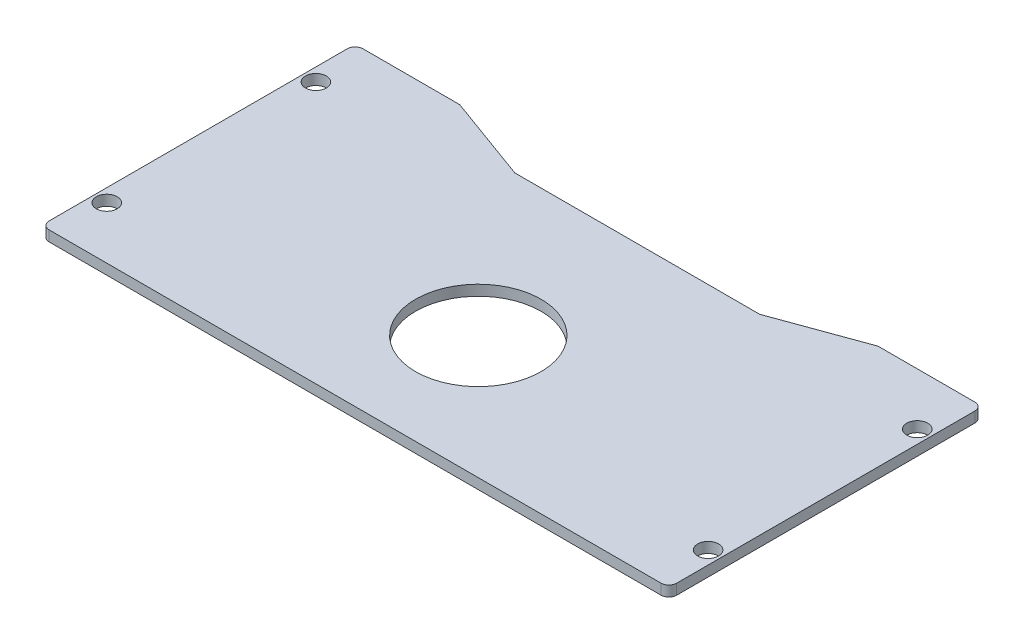
ISO-10303-21;
HEADER;
FILE_DESCRIPTION(('STEP AP214'),'2;1');
FILE_NAME('part.step','',(''),(''),'','','');
FILE_SCHEMA(('AUTOMOTIVE_DESIGN { 1 0 10303 214 1 1 1 1 }'));
ENDSEC;
DATA;
#1=APPLICATION_CONTEXT('core data for automotive mechanical design processes');
#2=APPLICATION_PROTOCOL_DEFINITION('international standard','automotive_design',2000,#1);
#3=PRODUCT_CONTEXT('',#1,'mechanical');
#4=PRODUCT('Part','Part','',(#3));
#5=PRODUCT_RELATED_PRODUCT_CATEGORY('part','',(#4));
#6=PRODUCT_DEFINITION_FORMATION('','',#4);
#7=PRODUCT_DEFINITION_CONTEXT('part definition',#1,'design');
#8=PRODUCT_DEFINITION('design','',#6,#7);
#9=PRODUCT_DEFINITION_SHAPE('','',#8);
#10=(LENGTH_UNIT() NAMED_UNIT(*) SI_UNIT(.MILLI.,.METRE.));
#11=(NAMED_UNIT(*) PLANE_ANGLE_UNIT() SI_UNIT($,.RADIAN.));
#12=(NAMED_UNIT(*) SI_UNIT($,.STERADIAN.) SOLID_ANGLE_UNIT());
#13=UNCERTAINTY_MEASURE_WITH_UNIT(LENGTH_MEASURE(1.E-05),#10,'distance_accuracy_value','');
#14=(GEOMETRIC_REPRESENTATION_CONTEXT(3) GLOBAL_UNCERTAINTY_ASSIGNED_CONTEXT((#13)) GLOBAL_UNIT_ASSIGNED_CONTEXT((#10,
#11,#12)) REPRESENTATION_CONTEXT('',''));
#15=CARTESIAN_POINT('',(0.,0.,0.));
#16=DIRECTION('',(0.,0.,1.));
#17=DIRECTION('',(1.,0.,0.));
#18=AXIS2_PLACEMENT_3D('',#15,#16,#17);
#19=CARTESIAN_POINT('',(0.,2.,-60.));
#20=DIRECTION('',(0.,0.,1.));
#21=DIRECTION('',(1.,0.,0.));
#22=AXIS2_PLACEMENT_3D('',#19,#20,#21);
#23=PLANE('',#22);
#24=DIRECTION('',(-1.,0.,0.));
#25=VECTOR('',#24,1.);
#26=CARTESIAN_POINT('',(0.,0.,-60.));
#27=LINE('',#26,#25);
#28=CARTESIAN_POINT('',(20.,0.,-60.));
#29=VERTEX_POINT('',#28);
#30=CARTESIAN_POINT('',(1.5,0.,-60.));
#31=VERTEX_POINT('',#30);
#32=EDGE_CURVE('E152',#29,#31,#27,.T.);
#33=ORIENTED_EDGE('',*,*,#32,.T.);
#34=DIRECTION('',(0.,-1.,0.));
#35=VECTOR('',#34,1.);
#36=CARTESIAN_POINT('',(1.5,2.,-60.));
#37=LINE('',#36,#35);
#38=CARTESIAN_POINT('',(1.5,2.,-60.));
#39=VERTEX_POINT('',#38);
#40=EDGE_CURVE('E11',#31,#39,#37,.F.);
#41=ORIENTED_EDGE('',*,*,#40,.T.);
#42=DIRECTION('',(-1.,0.,0.));
#43=VECTOR('',#42,1.);
#44=CARTESIAN_POINT('',(0.,2.,-60.));
#45=LINE('',#44,#43);
#46=CARTESIAN_POINT('',(20.,2.,-60.));
#47=VERTEX_POINT('',#46);
#48=EDGE_CURVE('E155',#47,#39,#45,.T.);
#49=ORIENTED_EDGE('',*,*,#48,.F.);
#50=DIRECTION('',(0.,1.,0.));
#51=VECTOR('',#50,1.);
#52=CARTESIAN_POINT('',(20.,-80.2273483978274,-60.));
#53=LINE('',#52,#51);
#54=EDGE_CURVE('E140',#29,#47,#53,.T.);
#55=ORIENTED_EDGE('',*,*,#54,.F.);
#56=EDGE_LOOP('',(#33,#41,#49,#55));
#57=FACE_BOUND('',#56,.T.);
#58=ADVANCED_FACE('F45',(#57),#23,.F.);
#59=CARTESIAN_POINT('',(0.,2.,0.));
#60=DIRECTION('',(1.,0.,0.));
#61=DIRECTION('',(0.,0.,-1.));
#62=AXIS2_PLACEMENT_3D('',#59,#60,#61);
#63=PLANE('',#62);
#64=DIRECTION('',(0.,0.,1.));
#65=VECTOR('',#64,1.);
#66=CARTESIAN_POINT('',(0.,0.,0.));
#67=LINE('',#66,#65);
#68=CARTESIAN_POINT('',(0.,0.,-58.5));
#69=VERTEX_POINT('',#68);
#70=CARTESIAN_POINT('',(0.,0.,-1.5));
#71=VERTEX_POINT('',#70);
#72=EDGE_CURVE('E238',#69,#71,#67,.T.);
#73=ORIENTED_EDGE('',*,*,#72,.T.);
#74=DIRECTION('',(0.,-1.,0.));
#75=VECTOR('',#74,1.);
#76=CARTESIAN_POINT('',(0.,2.,-1.5));
#77=LINE('',#76,#75);
#78=CARTESIAN_POINT('',(0.,2.,-1.5));
#79=VERTEX_POINT('',#78);
#80=EDGE_CURVE('E54',#71,#79,#77,.F.);
#81=ORIENTED_EDGE('',*,*,#80,.T.);
#82=DIRECTION('',(0.,0.,1.));
#83=VECTOR('',#82,1.);
#84=CARTESIAN_POINT('',(0.,2.,0.));
#85=LINE('',#84,#83);
#86=CARTESIAN_POINT('',(0.,2.,-58.5));
#87=VERTEX_POINT('',#86);
#88=EDGE_CURVE('E170',#87,#79,#85,.T.);
#89=ORIENTED_EDGE('',*,*,#88,.F.);
#90=DIRECTION('',(0.,-1.,0.));
#91=VECTOR('',#90,1.);
#92=CARTESIAN_POINT('',(0.,2.,-58.5));
#93=LINE('',#92,#91);
#94=EDGE_CURVE('E217',#87,#69,#93,.T.);
#95=ORIENTED_EDGE('',*,*,#94,.T.);
#96=EDGE_LOOP('',(#73,#81,#89,#95));
#97=FACE_BOUND('',#96,.T.);
#98=ADVANCED_FACE('F340',(#97),#63,.F.);
#99=CARTESIAN_POINT('',(0.,2.,0.));
#100=DIRECTION('',(0.,0.,-1.));
#101=DIRECTION('',(-1.,0.,0.));
#102=AXIS2_PLACEMENT_3D('',#99,#100,#101);
#103=PLANE('',#102);
#104=DIRECTION('',(1.,0.,0.));
#105=VECTOR('',#104,1.);
#106=CARTESIAN_POINT('',(0.,0.,0.));
#107=LINE('',#106,#105);
#108=CARTESIAN_POINT('',(1.5,0.,0.));
#109=VERTEX_POINT('',#108);
#110=CARTESIAN_POINT('',(118.5,0.,0.));
#111=VERTEX_POINT('',#110);
#112=EDGE_CURVE('E172',#109,#111,#107,.T.);
#113=ORIENTED_EDGE('',*,*,#112,.T.);
#114=DIRECTION('',(0.,-1.,0.));
#115=VECTOR('',#114,1.);
#116=CARTESIAN_POINT('',(118.5,2.,0.));
#117=LINE('',#116,#115);
#118=CARTESIAN_POINT('',(118.5,2.,0.));
#119=VERTEX_POINT('',#118);
#120=EDGE_CURVE('E199',#111,#119,#117,.F.);
#121=ORIENTED_EDGE('',*,*,#120,.T.);
#122=DIRECTION('',(1.,0.,0.));
#123=VECTOR('',#122,1.);
#124=CARTESIAN_POINT('',(0.,2.,0.));
#125=LINE('',#124,#123);
#126=CARTESIAN_POINT('',(1.5,2.,0.));
#127=VERTEX_POINT('',#126);
#128=EDGE_CURVE('E227',#127,#119,#125,.T.);
#129=ORIENTED_EDGE('',*,*,#128,.F.);
#130=DIRECTION('',(0.,-1.,0.));
#131=VECTOR('',#130,1.);
#132=CARTESIAN_POINT('',(1.5,2.,0.));
#133=LINE('',#132,#131);
#134=EDGE_CURVE('E195',#127,#109,#133,.T.);
#135=ORIENTED_EDGE('',*,*,#134,.T.);
#136=EDGE_LOOP('',(#113,#121,#129,#135));
#137=FACE_BOUND('',#136,.T.);
#138=ADVANCED_FACE('F245',(#137),#103,.F.);
#139=CARTESIAN_POINT('',(120.,2.,0.));
#140=DIRECTION('',(-1.,0.,0.));
#141=DIRECTION('',(0.,0.,1.));
#142=AXIS2_PLACEMENT_3D('',#139,#140,#141);
#143=PLANE('',#142);
#144=DIRECTION('',(0.,0.,-1.));
#145=VECTOR('',#144,1.);
#146=CARTESIAN_POINT('',(120.,2.,0.));
#147=LINE('',#146,#145);
#148=CARTESIAN_POINT('',(120.,2.,-1.5));
#149=VERTEX_POINT('',#148);
#150=CARTESIAN_POINT('',(120.,2.,-58.5));
#151=VERTEX_POINT('',#150);
#152=EDGE_CURVE('E225',#149,#151,#147,.T.);
#153=ORIENTED_EDGE('',*,*,#152,.F.);
#154=DIRECTION('',(0.,-1.,0.));
#155=VECTOR('',#154,1.);
#156=CARTESIAN_POINT('',(120.,2.,-1.5));
#157=LINE('',#156,#155);
#158=CARTESIAN_POINT('',(120.,0.,-1.5));
#159=VERTEX_POINT('',#158);
#160=EDGE_CURVE('E179',#149,#159,#157,.T.);
#161=ORIENTED_EDGE('',*,*,#160,.T.);
#162=DIRECTION('',(0.,0.,-1.));
#163=VECTOR('',#162,1.);
#164=CARTESIAN_POINT('',(120.,0.,0.));
#165=LINE('',#164,#163);
#166=CARTESIAN_POINT('',(120.,0.,-58.5));
#167=VERTEX_POINT('',#166);
#168=EDGE_CURVE('E166',#159,#167,#165,.T.);
#169=ORIENTED_EDGE('',*,*,#168,.T.);
#170=DIRECTION('',(0.,-1.,0.));
#171=VECTOR('',#170,1.);
#172=CARTESIAN_POINT('',(120.,2.,-58.5));
#173=LINE('',#172,#171);
#174=EDGE_CURVE('E176',#167,#151,#173,.F.);
#175=ORIENTED_EDGE('',*,*,#174,.T.);
#176=EDGE_LOOP('',(#153,#161,#169,#175));
#177=FACE_BOUND('',#176,.T.);
#178=ADVANCED_FACE('F255',(#177),#143,.F.);
#179=CARTESIAN_POINT('',(118.5,2.,-60.));
#180=VERTEX_POINT('',#179);
#181=CARTESIAN_POINT('',(100.,2.,-60.));
#182=VERTEX_POINT('',#181);
#183=EDGE_CURVE('E180',#180,#182,#45,.T.);
#184=ORIENTED_EDGE('',*,*,#183,.F.);
#185=DIRECTION('',(0.,-1.,0.));
#186=VECTOR('',#185,1.);
#187=CARTESIAN_POINT('',(118.5,2.,-60.));
#188=LINE('',#187,#186);
#189=CARTESIAN_POINT('',(118.5,0.,-60.));
#190=VERTEX_POINT('',#189);
#191=EDGE_CURVE('E213',#180,#190,#188,.T.);
#192=ORIENTED_EDGE('',*,*,#191,.T.);
#193=CARTESIAN_POINT('',(100.,0.,-60.));
#194=VERTEX_POINT('',#193);
#195=EDGE_CURVE('E165',#190,#194,#27,.T.);
#196=ORIENTED_EDGE('',*,*,#195,.T.);
#197=DIRECTION('',(0.,1.,0.));
#198=VECTOR('',#197,1.);
#199=CARTESIAN_POINT('',(100.,-80.2273483978274,-60.));
#200=LINE('',#199,#198);
#201=EDGE_CURVE('E157',#194,#182,#200,.T.);
#202=ORIENTED_EDGE('',*,*,#201,.T.);
#203=EDGE_LOOP('',(#184,#192,#196,#202));
#204=FACE_BOUND('',#203,.T.);
#205=ADVANCED_FACE('F262',(#204),#23,.F.);
#206=CARTESIAN_POINT('',(0.,2.,0.));
#207=DIRECTION('',(0.,-1.,0.));
#208=DIRECTION('',(0.,0.,-1.));
#209=AXIS2_PLACEMENT_3D('',#206,#207,#208);
#210=PLANE('',#209);
#211=CARTESIAN_POINT('',(59.9999999999971,2.,-23.5563491861068));
#212=DIRECTION('',(0.,1.,0.));
#213=DIRECTION('',(0.,0.,1.));
#214=AXIS2_PLACEMENT_3D('',#211,#212,#213);
#215=CIRCLE('',#214,12.);
#216=CARTESIAN_POINT('',(59.9999999999971,2.,-11.5563491861068));
#217=VERTEX_POINT('',#216);
#218=EDGE_CURVE('E282',#217,#217,#215,.T.);
#219=ORIENTED_EDGE('',*,*,#218,.F.);
#220=EDGE_LOOP('',(#219));
#221=FACE_BOUND('',#220,.T.);
#222=CARTESIAN_POINT('',(117.5,2.,-9.99999999999999));
#223=DIRECTION('',(0.,1.,0.));
#224=DIRECTION('',(0.,0.,-1.));
#225=AXIS2_PLACEMENT_3D('',#222,#223,#224);
#226=CIRCLE('',#225,2.);
#227=CARTESIAN_POINT('',(117.5,2.,-12.));
#228=VERTEX_POINT('',#227);
#229=EDGE_CURVE('E304',#228,#228,#226,.T.);
#230=ORIENTED_EDGE('',*,*,#229,.F.);
#231=EDGE_LOOP('',(#230));
#232=FACE_BOUND('',#231,.T.);
#233=CARTESIAN_POINT('',(2.5,2.,-50.));
#234=DIRECTION('',(0.,1.,0.));
#235=DIRECTION('',(0.,0.,-1.));
#236=AXIS2_PLACEMENT_3D('',#233,#234,#235);
#237=CIRCLE('',#236,2.);
#238=CARTESIAN_POINT('',(2.5,2.,-52.));
#239=VERTEX_POINT('',#238);
#240=EDGE_CURVE('E305',#239,#239,#237,.T.);
#241=ORIENTED_EDGE('',*,*,#240,.F.);
#242=EDGE_LOOP('',(#241));
#243=FACE_BOUND('',#242,.T.);
#244=CARTESIAN_POINT('',(2.5,2.,-9.99999999999999));
#245=DIRECTION('',(0.,1.,0.));
#246=DIRECTION('',(0.,0.,1.));
#247=AXIS2_PLACEMENT_3D('',#244,#245,#246);
#248=CIRCLE('',#247,2.);
#249=CARTESIAN_POINT('',(2.5,2.,-8.));
#250=VERTEX_POINT('',#249);
#251=EDGE_CURVE('E294',#250,#250,#248,.T.);
#252=ORIENTED_EDGE('',*,*,#251,.F.);
#253=EDGE_LOOP('',(#252));
#254=FACE_BOUND('',#253,.T.);
#255=CARTESIAN_POINT('',(117.5,2.,-50.));
#256=DIRECTION('',(0.,1.,0.));
#257=DIRECTION('',(0.,0.,1.));
#258=AXIS2_PLACEMENT_3D('',#255,#256,#257);
#259=CIRCLE('',#258,2.);
#260=CARTESIAN_POINT('',(117.5,2.,-48.));
#261=VERTEX_POINT('',#260);
#262=EDGE_CURVE('E309',#261,#261,#259,.T.);
#263=ORIENTED_EDGE('',*,*,#262,.F.);
#264=EDGE_LOOP('',(#263));
#265=FACE_BOUND('',#264,.T.);
#266=ORIENTED_EDGE('',*,*,#128,.T.);
#267=CARTESIAN_POINT('',(118.5,2.,-1.5));
#268=DIRECTION('',(0.,-1.,0.));
#269=DIRECTION('',(0.,0.,-1.));
#270=AXIS2_PLACEMENT_3D('',#267,#268,#269);
#271=CIRCLE('',#270,1.5);
#272=EDGE_CURVE('E210',#119,#149,#271,.F.);
#273=ORIENTED_EDGE('',*,*,#272,.T.);
#274=ORIENTED_EDGE('',*,*,#152,.T.);
#275=CARTESIAN_POINT('',(118.5,2.,-58.5));
#276=DIRECTION('',(0.,-1.,0.));
#277=DIRECTION('',(0.,0.,-1.));
#278=AXIS2_PLACEMENT_3D('',#275,#276,#277);
#279=CIRCLE('',#278,1.5);
#280=EDGE_CURVE('E61',#151,#180,#279,.F.);
#281=ORIENTED_EDGE('',*,*,#280,.T.);
#282=ORIENTED_EDGE('',*,*,#183,.T.);
#283=DIRECTION('',(0.939692620785911,0.,-0.342020143325662));
#284=VECTOR('',#283,1.);
#285=CARTESIAN_POINT('',(100.,2.,-60.));
#286=LINE('',#285,#284);
#287=CARTESIAN_POINT('',(83.4175611827647,2.,-53.964485858986));
#288=VERTEX_POINT('',#287);
#289=EDGE_CURVE('E147',#288,#182,#286,.T.);
#290=ORIENTED_EDGE('',*,*,#289,.F.);
#291=DIRECTION('',(1.,0.,0.));
#292=VECTOR('',#291,1.);
#293=CARTESIAN_POINT('',(36.5824388172353,2.,-53.964485858986));
#294=LINE('',#293,#292);
#295=CARTESIAN_POINT('',(36.5824388172353,2.,-53.964485858986));
#296=VERTEX_POINT('',#295);
#297=EDGE_CURVE('E283',#296,#288,#294,.T.);
#298=ORIENTED_EDGE('',*,*,#297,.F.);
#299=DIRECTION('',(0.939692620785911,0.,0.342020143325663));
#300=VECTOR('',#299,1.);
#301=CARTESIAN_POINT('',(20.,2.,-60.));
#302=LINE('',#301,#300);
#303=EDGE_CURVE('E279',#47,#296,#302,.T.);
#304=ORIENTED_EDGE('',*,*,#303,.F.);
#305=ORIENTED_EDGE('',*,*,#48,.T.);
#306=CARTESIAN_POINT('',(1.5,2.,-58.5));
#307=DIRECTION('',(0.,-1.,0.));
#308=DIRECTION('',(0.,0.,-1.));
#309=AXIS2_PLACEMENT_3D('',#306,#307,#308);
#310=CIRCLE('',#309,1.5);
#311=EDGE_CURVE('E202',#39,#87,#310,.F.);
#312=ORIENTED_EDGE('',*,*,#311,.T.);
#313=ORIENTED_EDGE('',*,*,#88,.T.);
#314=CARTESIAN_POINT('',(1.5,2.,-1.5));
#315=DIRECTION('',(0.,-1.,0.));
#316=DIRECTION('',(0.,0.,-1.));
#317=AXIS2_PLACEMENT_3D('',#314,#315,#316);
#318=CIRCLE('',#317,1.5);
#319=EDGE_CURVE('E205',#79,#127,#318,.F.);
#320=ORIENTED_EDGE('',*,*,#319,.T.);
#321=EDGE_LOOP('',(#266,#273,#274,#281,#282,#290,#298,#304,#305,#312,#313,#320));
#322=FACE_BOUND('',#321,.T.);
#323=ADVANCED_FACE('F253',(#221,#232,#243,#254,#265,#322),#210,.F.);
#324=CARTESIAN_POINT('',(0.,0.,0.));
#325=DIRECTION('',(0.,-1.,0.));
#326=DIRECTION('',(0.,0.,-1.));
#327=AXIS2_PLACEMENT_3D('',#324,#325,#326);
#328=PLANE('',#327);
#329=CARTESIAN_POINT('',(59.9999999999971,0.,-23.5563491861068));
#330=DIRECTION('',(0.,-1.,0.));
#331=DIRECTION('',(0.,0.,-1.));
#332=AXIS2_PLACEMENT_3D('',#329,#330,#331);
#333=CIRCLE('',#332,12.);
#334=CARTESIAN_POINT('',(59.9999999999971,0.,-35.5563491861068));
#335=VERTEX_POINT('',#334);
#336=EDGE_CURVE('E295',#335,#335,#333,.F.);
#337=ORIENTED_EDGE('',*,*,#336,.T.);
#338=EDGE_LOOP('',(#337));
#339=FACE_BOUND('',#338,.T.);
#340=ORIENTED_EDGE('',*,*,#168,.F.);
#341=CARTESIAN_POINT('',(118.5,0.,-1.5));
#342=DIRECTION('',(0.,-1.,0.));
#343=DIRECTION('',(0.,0.,-1.));
#344=AXIS2_PLACEMENT_3D('',#341,#342,#343);
#345=CIRCLE('',#344,1.5);
#346=EDGE_CURVE('E192',#159,#111,#345,.T.);
#347=ORIENTED_EDGE('',*,*,#346,.T.);
#348=ORIENTED_EDGE('',*,*,#112,.F.);
#349=CARTESIAN_POINT('',(1.5,0.,-1.5));
#350=DIRECTION('',(0.,-1.,0.));
#351=DIRECTION('',(0.,0.,-1.));
#352=AXIS2_PLACEMENT_3D('',#349,#350,#351);
#353=CIRCLE('',#352,1.5);
#354=EDGE_CURVE('E186',#109,#71,#353,.T.);
#355=ORIENTED_EDGE('',*,*,#354,.T.);
#356=ORIENTED_EDGE('',*,*,#72,.F.);
#357=CARTESIAN_POINT('',(1.5,0.,-58.5));
#358=DIRECTION('',(0.,-1.,0.));
#359=DIRECTION('',(0.,0.,-1.));
#360=AXIS2_PLACEMENT_3D('',#357,#358,#359);
#361=CIRCLE('',#360,1.5);
#362=EDGE_CURVE('E163',#69,#31,#361,.T.);
#363=ORIENTED_EDGE('',*,*,#362,.T.);
#364=ORIENTED_EDGE('',*,*,#32,.F.);
#365=DIRECTION('',(0.939692620785911,0.,0.342020143325663));
#366=VECTOR('',#365,1.);
#367=CARTESIAN_POINT('',(20.,0.,-60.));
#368=LINE('',#367,#366);
#369=CARTESIAN_POINT('',(36.5824388172353,0.,-53.964485858986));
#370=VERTEX_POINT('',#369);
#371=EDGE_CURVE('E136',#29,#370,#368,.T.);
#372=ORIENTED_EDGE('',*,*,#371,.T.);
#373=DIRECTION('',(1.,0.,0.));
#374=VECTOR('',#373,1.);
#375=CARTESIAN_POINT('',(36.5824388172353,0.,-53.964485858986));
#376=LINE('',#375,#374);
#377=CARTESIAN_POINT('',(83.4175611827647,0.,-53.964485858986));
#378=VERTEX_POINT('',#377);
#379=EDGE_CURVE('E267',#370,#378,#376,.T.);
#380=ORIENTED_EDGE('',*,*,#379,.T.);
#381=DIRECTION('',(0.939692620785911,0.,-0.342020143325662));
#382=VECTOR('',#381,1.);
#383=CARTESIAN_POINT('',(100.,0.,-60.));
#384=LINE('',#383,#382);
#385=EDGE_CURVE('E266',#378,#194,#384,.T.);
#386=ORIENTED_EDGE('',*,*,#385,.T.);
#387=ORIENTED_EDGE('',*,*,#195,.F.);
#388=CARTESIAN_POINT('',(118.5,0.,-58.5));
#389=DIRECTION('',(0.,-1.,0.));
#390=DIRECTION('',(0.,0.,-1.));
#391=AXIS2_PLACEMENT_3D('',#388,#389,#390);
#392=CIRCLE('',#391,1.5);
#393=EDGE_CURVE('E189',#190,#167,#392,.T.);
#394=ORIENTED_EDGE('',*,*,#393,.T.);
#395=EDGE_LOOP('',(#340,#347,#348,#355,#356,#363,#364,#372,#380,#386,#387,#394));
#396=FACE_BOUND('',#395,.T.);
#397=CARTESIAN_POINT('',(117.5,0.,-9.99999999999999));
#398=DIRECTION('',(0.,-1.,0.));
#399=DIRECTION('',(0.,0.,-1.));
#400=AXIS2_PLACEMENT_3D('',#397,#398,#399);
#401=CIRCLE('',#400,2.);
#402=CARTESIAN_POINT('',(117.5,0.,-12.));
#403=VERTEX_POINT('',#402);
#404=EDGE_CURVE('E300',#403,#403,#401,.F.);
#405=ORIENTED_EDGE('',*,*,#404,.T.);
#406=EDGE_LOOP('',(#405));
#407=FACE_BOUND('',#406,.T.);
#408=CARTESIAN_POINT('',(2.5,0.,-50.));
#409=DIRECTION('',(0.,-1.,0.));
#410=DIRECTION('',(0.,0.,-1.));
#411=AXIS2_PLACEMENT_3D('',#408,#409,#410);
#412=CIRCLE('',#411,2.);
#413=CARTESIAN_POINT('',(2.5,0.,-52.));
#414=VERTEX_POINT('',#413);
#415=EDGE_CURVE('E299',#414,#414,#412,.F.);
#416=ORIENTED_EDGE('',*,*,#415,.T.);
#417=EDGE_LOOP('',(#416));
#418=FACE_BOUND('',#417,.T.);
#419=CARTESIAN_POINT('',(2.5,0.,-9.99999999999999));
#420=DIRECTION('',(0.,-1.,0.));
#421=DIRECTION('',(0.,0.,-1.));
#422=AXIS2_PLACEMENT_3D('',#419,#420,#421);
#423=CIRCLE('',#422,2.);
#424=CARTESIAN_POINT('',(2.5,0.,-12.));
#425=VERTEX_POINT('',#424);
#426=EDGE_CURVE('E290',#425,#425,#423,.F.);
#427=ORIENTED_EDGE('',*,*,#426,.T.);
#428=EDGE_LOOP('',(#427));
#429=FACE_BOUND('',#428,.T.);
#430=CARTESIAN_POINT('',(117.5,0.,-50.));
#431=DIRECTION('',(0.,-1.,0.));
#432=DIRECTION('',(0.,0.,-1.));
#433=AXIS2_PLACEMENT_3D('',#430,#431,#432);
#434=CIRCLE('',#433,2.);
#435=CARTESIAN_POINT('',(117.5,0.,-52.));
#436=VERTEX_POINT('',#435);
#437=EDGE_CURVE('E235',#436,#436,#434,.F.);
#438=ORIENTED_EDGE('',*,*,#437,.T.);
#439=EDGE_LOOP('',(#438));
#440=FACE_BOUND('',#439,.T.);
#441=ADVANCED_FACE('F160',(#339,#396,#407,#418,#429,#440),#328,.T.);
#442=CARTESIAN_POINT('',(117.5,-5.65685424949238,-50.));
#443=DIRECTION('',(0.,1.,0.));
#444=DIRECTION('',(0.,0.,1.));
#445=AXIS2_PLACEMENT_3D('',#442,#443,#444);
#446=CYLINDRICAL_SURFACE('',#445,2.);
#447=ORIENTED_EDGE('',*,*,#262,.T.);
#448=EDGE_LOOP('',(#447));
#449=FACE_BOUND('',#448,.T.);
#450=ORIENTED_EDGE('',*,*,#437,.F.);
#451=EDGE_LOOP('',(#450));
#452=FACE_BOUND('',#451,.T.);
#453=ADVANCED_FACE('F324',(#449,#452),#446,.F.);
#454=CARTESIAN_POINT('',(2.5,-5.65685424949238,-9.99999999999999));
#455=DIRECTION('',(0.,1.,0.));
#456=DIRECTION('',(0.,0.,1.));
#457=AXIS2_PLACEMENT_3D('',#454,#455,#456);
#458=CYLINDRICAL_SURFACE('',#457,2.);
#459=ORIENTED_EDGE('',*,*,#251,.T.);
#460=EDGE_LOOP('',(#459));
#461=FACE_BOUND('',#460,.T.);
#462=ORIENTED_EDGE('',*,*,#426,.F.);
#463=EDGE_LOOP('',(#462));
#464=FACE_BOUND('',#463,.T.);
#465=ADVANCED_FACE('F326',(#461,#464),#458,.F.);
#466=CARTESIAN_POINT('',(2.5,-5.65685424949238,-50.));
#467=DIRECTION('',(0.,1.,0.));
#468=DIRECTION('',(0.,0.,1.));
#469=AXIS2_PLACEMENT_3D('',#466,#467,#468);
#470=CYLINDRICAL_SURFACE('',#469,2.);
#471=ORIENTED_EDGE('',*,*,#240,.T.);
#472=EDGE_LOOP('',(#471));
#473=FACE_BOUND('',#472,.T.);
#474=ORIENTED_EDGE('',*,*,#415,.F.);
#475=EDGE_LOOP('',(#474));
#476=FACE_BOUND('',#475,.T.);
#477=ADVANCED_FACE('F331',(#473,#476),#470,.F.);
#478=CARTESIAN_POINT('',(117.5,-5.65685424949238,-9.99999999999999));
#479=DIRECTION('',(0.,1.,0.));
#480=DIRECTION('',(0.,0.,1.));
#481=AXIS2_PLACEMENT_3D('',#478,#479,#480);
#482=CYLINDRICAL_SURFACE('',#481,2.);
#483=ORIENTED_EDGE('',*,*,#229,.T.);
#484=EDGE_LOOP('',(#483));
#485=FACE_BOUND('',#484,.T.);
#486=ORIENTED_EDGE('',*,*,#404,.F.);
#487=EDGE_LOOP('',(#486));
#488=FACE_BOUND('',#487,.T.);
#489=ADVANCED_FACE('F401',(#485,#488),#482,.F.);
#490=CARTESIAN_POINT('',(20.,-80.2273483978274,-60.));
#491=DIRECTION('',(-0.342020143325663,0.,0.939692620785911));
#492=DIRECTION('',(0.939692620785911,0.,0.342020143325663));
#493=AXIS2_PLACEMENT_3D('',#490,#491,#492);
#494=PLANE('',#493);
#495=ORIENTED_EDGE('',*,*,#54,.T.);
#496=ORIENTED_EDGE('',*,*,#303,.T.);
#497=DIRECTION('',(0.,1.,0.));
#498=VECTOR('',#497,1.);
#499=CARTESIAN_POINT('',(36.5824388172353,-80.2273483978274,-53.964485858986));
#500=LINE('',#499,#498);
#501=EDGE_CURVE('E142',#370,#296,#500,.T.);
#502=ORIENTED_EDGE('',*,*,#501,.F.);
#503=ORIENTED_EDGE('',*,*,#371,.F.);
#504=EDGE_LOOP('',(#495,#496,#502,#503));
#505=FACE_BOUND('',#504,.T.);
#506=ADVANCED_FACE('F138',(#505),#494,.F.);
#507=CARTESIAN_POINT('',(36.5824388172353,-80.2273483978274,-53.964485858986));
#508=DIRECTION('',(0.,0.,1.));
#509=DIRECTION('',(1.,0.,0.));
#510=AXIS2_PLACEMENT_3D('',#507,#508,#509);
#511=PLANE('',#510);
#512=ORIENTED_EDGE('',*,*,#501,.T.);
#513=ORIENTED_EDGE('',*,*,#297,.T.);
#514=DIRECTION('',(0.,1.,0.));
#515=VECTOR('',#514,1.);
#516=CARTESIAN_POINT('',(83.4175611827647,-80.2273483978274,-53.964485858986));
#517=LINE('',#516,#515);
#518=EDGE_CURVE('E271',#378,#288,#517,.T.);
#519=ORIENTED_EDGE('',*,*,#518,.F.);
#520=ORIENTED_EDGE('',*,*,#379,.F.);
#521=EDGE_LOOP('',(#512,#513,#519,#520));
#522=FACE_BOUND('',#521,.T.);
#523=ADVANCED_FACE('F375',(#522),#511,.F.);
#524=CARTESIAN_POINT('',(100.,-80.2273483978274,-60.));
#525=DIRECTION('',(0.342020143325662,0.,0.939692620785911));
#526=DIRECTION('',(0.939692620785911,0.,-0.342020143325662));
#527=AXIS2_PLACEMENT_3D('',#524,#525,#526);
#528=PLANE('',#527);
#529=ORIENTED_EDGE('',*,*,#518,.T.);
#530=ORIENTED_EDGE('',*,*,#289,.T.);
#531=ORIENTED_EDGE('',*,*,#201,.F.);
#532=ORIENTED_EDGE('',*,*,#385,.F.);
#533=EDGE_LOOP('',(#529,#530,#531,#532));
#534=FACE_BOUND('',#533,.T.);
#535=ADVANCED_FACE('F410',(#534),#528,.F.);
#536=CARTESIAN_POINT('',(59.9999999999971,-80.2273483978274,-23.5563491861068));
#537=DIRECTION('',(0.,1.,0.));
#538=DIRECTION('',(0.,0.,1.));
#539=AXIS2_PLACEMENT_3D('',#536,#537,#538);
#540=CYLINDRICAL_SURFACE('',#539,12.);
#541=ORIENTED_EDGE('',*,*,#218,.T.);
#542=EDGE_LOOP('',(#541));
#543=FACE_BOUND('',#542,.T.);
#544=ORIENTED_EDGE('',*,*,#336,.F.);
#545=EDGE_LOOP('',(#544));
#546=FACE_BOUND('',#545,.T.);
#547=ADVANCED_FACE('F361',(#543,#546),#540,.F.);
#548=CARTESIAN_POINT('',(118.5,2.,-1.5));
#549=DIRECTION('',(0.,-1.,0.));
#550=DIRECTION('',(0.,0.,-1.));
#551=AXIS2_PLACEMENT_3D('',#548,#549,#550);
#552=CYLINDRICAL_SURFACE('',#551,1.5);
#553=ORIENTED_EDGE('',*,*,#272,.F.);
#554=ORIENTED_EDGE('',*,*,#120,.F.);
#555=ORIENTED_EDGE('',*,*,#346,.F.);
#556=ORIENTED_EDGE('',*,*,#160,.F.);
#557=EDGE_LOOP('',(#553,#554,#555,#556));
#558=FACE_BOUND('',#557,.T.);
#559=ADVANCED_FACE('F250',(#558),#552,.T.);
#560=CARTESIAN_POINT('',(118.5,2.,-58.5));
#561=DIRECTION('',(0.,-1.,0.));
#562=DIRECTION('',(0.,0.,-1.));
#563=AXIS2_PLACEMENT_3D('',#560,#561,#562);
#564=CYLINDRICAL_SURFACE('',#563,1.5);
#565=ORIENTED_EDGE('',*,*,#280,.F.);
#566=ORIENTED_EDGE('',*,*,#174,.F.);
#567=ORIENTED_EDGE('',*,*,#393,.F.);
#568=ORIENTED_EDGE('',*,*,#191,.F.);
#569=EDGE_LOOP('',(#565,#566,#567,#568));
#570=FACE_BOUND('',#569,.T.);
#571=ADVANCED_FACE('F258',(#570),#564,.T.);
#572=CARTESIAN_POINT('',(1.5,2.,-1.5));
#573=DIRECTION('',(0.,-1.,0.));
#574=DIRECTION('',(0.,0.,-1.));
#575=AXIS2_PLACEMENT_3D('',#572,#573,#574);
#576=CYLINDRICAL_SURFACE('',#575,1.5);
#577=ORIENTED_EDGE('',*,*,#319,.F.);
#578=ORIENTED_EDGE('',*,*,#80,.F.);
#579=ORIENTED_EDGE('',*,*,#354,.F.);
#580=ORIENTED_EDGE('',*,*,#134,.F.);
#581=EDGE_LOOP('',(#577,#578,#579,#580));
#582=FACE_BOUND('',#581,.T.);
#583=ADVANCED_FACE('F363',(#582),#576,.T.);
#584=CARTESIAN_POINT('',(1.5,2.,-58.5));
#585=DIRECTION('',(0.,-1.,0.));
#586=DIRECTION('',(0.,0.,-1.));
#587=AXIS2_PLACEMENT_3D('',#584,#585,#586);
#588=CYLINDRICAL_SURFACE('',#587,1.5);
#589=ORIENTED_EDGE('',*,*,#311,.F.);
#590=ORIENTED_EDGE('',*,*,#40,.F.);
#591=ORIENTED_EDGE('',*,*,#362,.F.);
#592=ORIENTED_EDGE('',*,*,#94,.F.);
#593=EDGE_LOOP('',(#589,#590,#591,#592));
#594=FACE_BOUND('',#593,.T.);
#595=ADVANCED_FACE('F47',(#594),#588,.T.);
#596=CLOSED_SHELL('',(#58,#98,#138,#178,#205,#323,#441,#453,#465,#477,#489,#506,#523,#535,#547,
#559,#571,#583,#595));
#597=MANIFOLD_SOLID_BREP('B2',#596);
#598=ADVANCED_BREP_SHAPE_REPRESENTATION('',(#18,#597),#14);
#599=SHAPE_DEFINITION_REPRESENTATION(#9,#598);
ENDSEC;
END-ISO-10303-21;
